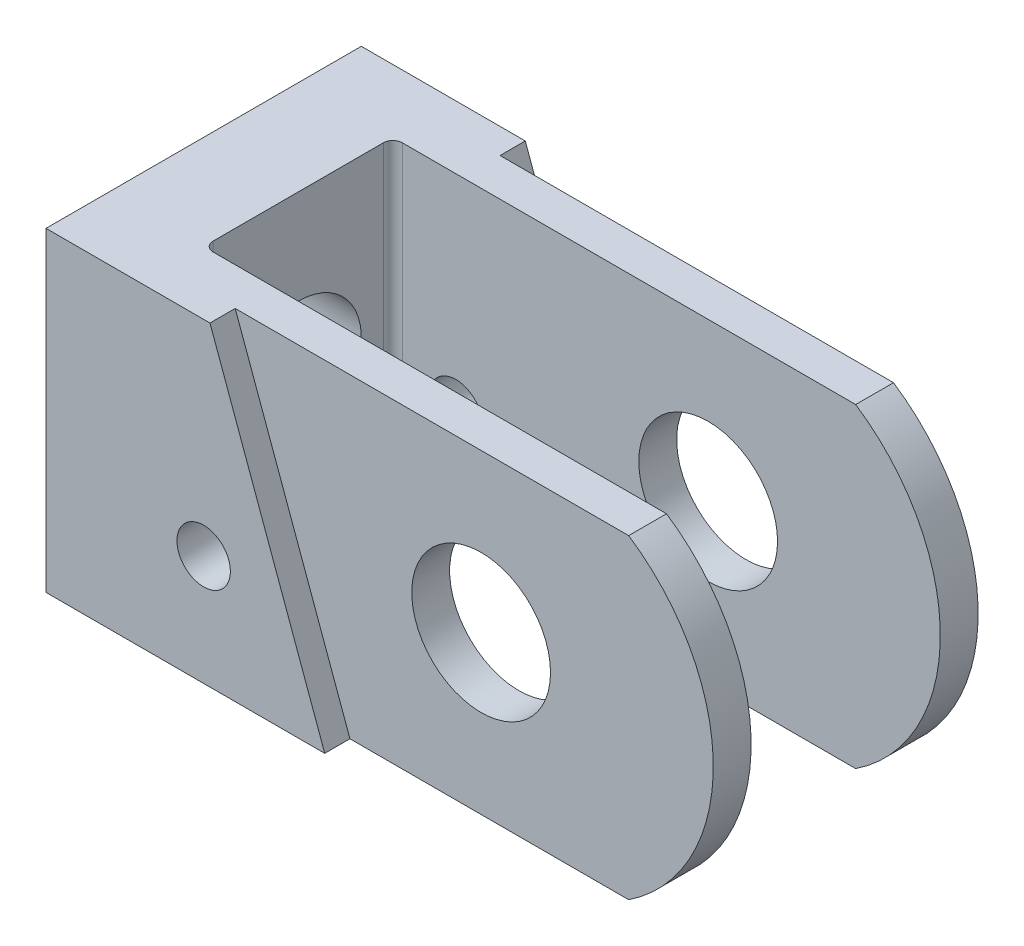
ISO-10303-21;
HEADER;
FILE_DESCRIPTION(('STEP AP214'),'2;1');
FILE_NAME('part.step','',(''),(''),'','','');
FILE_SCHEMA(('AUTOMOTIVE_DESIGN { 1 0 10303 214 1 1 1 1 }'));
ENDSEC;
DATA;
#1=APPLICATION_CONTEXT('core data for automotive mechanical design processes');
#2=APPLICATION_PROTOCOL_DEFINITION('international standard','automotive_design',2000,#1);
#3=PRODUCT_CONTEXT('',#1,'mechanical');
#4=PRODUCT('Part','Part','',(#3));
#5=PRODUCT_RELATED_PRODUCT_CATEGORY('part','',(#4));
#6=PRODUCT_DEFINITION_FORMATION('','',#4);
#7=PRODUCT_DEFINITION_CONTEXT('part definition',#1,'design');
#8=PRODUCT_DEFINITION('design','',#6,#7);
#9=PRODUCT_DEFINITION_SHAPE('','',#8);
#10=(LENGTH_UNIT() NAMED_UNIT(*) SI_UNIT(.MILLI.,.METRE.));
#11=(NAMED_UNIT(*) PLANE_ANGLE_UNIT() SI_UNIT($,.RADIAN.));
#12=(NAMED_UNIT(*) SI_UNIT($,.STERADIAN.) SOLID_ANGLE_UNIT());
#13=UNCERTAINTY_MEASURE_WITH_UNIT(LENGTH_MEASURE(1.E-05),#10,'distance_accuracy_value','');
#14=(GEOMETRIC_REPRESENTATION_CONTEXT(3) GLOBAL_UNCERTAINTY_ASSIGNED_CONTEXT((#13)) GLOBAL_UNIT_ASSIGNED_CONTEXT((#10,
#11,#12)) REPRESENTATION_CONTEXT('',''));
#15=CARTESIAN_POINT('',(0.,0.,0.));
#16=DIRECTION('',(0.,0.,1.));
#17=DIRECTION('',(1.,0.,0.));
#18=AXIS2_PLACEMENT_3D('',#15,#16,#17);
#19=CARTESIAN_POINT('',(0.,50.,26.3191489361702));
#20=DIRECTION('',(0.,0.,-1.));
#21=DIRECTION('',(-1.,0.,0.));
#22=AXIS2_PLACEMENT_3D('',#19,#20,#21);
#23=PLANE('',#22);
#24=CARTESIAN_POINT('',(30.8510638297872,25.,26.3191489361702));
#25=DIRECTION('',(0.,0.,1.));
#26=DIRECTION('',(1.,0.,0.));
#27=AXIS2_PLACEMENT_3D('',#24,#25,#26);
#28=CIRCLE('',#27,11.);
#29=CARTESIAN_POINT('',(41.8510638297872,25.,26.3191489361702));
#30=VERTEX_POINT('',#29);
#31=EDGE_CURVE('E231',#30,#30,#28,.T.);
#32=ORIENTED_EDGE('',*,*,#31,.F.);
#33=EDGE_LOOP('',(#32));
#34=FACE_BOUND('',#33,.T.);
#35=DIRECTION('',(1.,0.,0.));
#36=VECTOR('',#35,1.);
#37=CARTESIAN_POINT('',(0.,50.,26.3191489361702));
#38=LINE('',#37,#36);
#39=CARTESIAN_POINT('',(-8.14893617021278,50.,26.3191489361702));
#40=VERTEX_POINT('',#39);
#41=CARTESIAN_POINT('',(54.2426984198621,50.,26.3191489361702));
#42=VERTEX_POINT('',#41);
#43=EDGE_CURVE('E268',#40,#42,#38,.T.);
#44=ORIENTED_EDGE('',*,*,#43,.F.);
#45=DIRECTION('',(-0.342020143325673,0.939692620785907,0.));
#46=VECTOR('',#45,1.);
#47=CARTESIAN_POINT('',(-8.14893617021278,50.,26.3191489361702));
#48=LINE('',#47,#46);
#49=CARTESIAN_POINT('',(10.0495755430976,0.,26.3191489361702));
#50=VERTEX_POINT('',#49);
#51=EDGE_CURVE('E204',#50,#40,#48,.T.);
#52=ORIENTED_EDGE('',*,*,#51,.F.);
#53=DIRECTION('',(1.,0.,0.));
#54=VECTOR('',#53,1.);
#55=CARTESIAN_POINT('',(0.,0.,26.3191489361702));
#56=LINE('',#55,#54);
#57=CARTESIAN_POINT('',(54.2426984198621,0.,26.3191489361702));
#58=VERTEX_POINT('',#57);
#59=EDGE_CURVE('E76',#50,#58,#56,.T.);
#60=ORIENTED_EDGE('',*,*,#59,.T.);
#61=CARTESIAN_POINT('',(37.6595744680851,25.,26.3191489361702));
#62=DIRECTION('',(0.,0.,-1.));
#63=DIRECTION('',(1.,0.,0.));
#64=AXIS2_PLACEMENT_3D('',#61,#62,#63);
#65=CIRCLE('',#64,30.);
#66=EDGE_CURVE('E214',#42,#58,#65,.T.);
#67=ORIENTED_EDGE('',*,*,#66,.F.);
#68=EDGE_LOOP('',(#44,#52,#60,#67));
#69=FACE_BOUND('',#68,.T.);
#70=ADVANCED_FACE('F51',(#34,#69),#23,.F.);
#71=CARTESIAN_POINT('',(67.6595744680851,50.,20.3191489361702));
#72=DIRECTION('',(0.,0.,1.));
#73=DIRECTION('',(1.,0.,0.));
#74=AXIS2_PLACEMENT_3D('',#71,#72,#73);
#75=PLANE('',#74);
#76=CARTESIAN_POINT('',(-9.14893617021278,17.5,20.3191489361702));
#77=DIRECTION('',(0.,0.,1.));
#78=DIRECTION('',(1.,0.,0.));
#79=AXIS2_PLACEMENT_3D('',#76,#77,#78);
#80=CIRCLE('',#79,4.2371042598902);
#81=CARTESIAN_POINT('',(-4.91183191032258,17.5,20.3191489361702));
#82=VERTEX_POINT('',#81);
#83=EDGE_CURVE('E195',#82,#82,#80,.T.);
#84=ORIENTED_EDGE('',*,*,#83,.T.);
#85=EDGE_LOOP('',(#84));
#86=FACE_BOUND('',#85,.T.);
#87=CARTESIAN_POINT('',(30.8510638297872,25.,20.3191489361702));
#88=DIRECTION('',(0.,0.,1.));
#89=DIRECTION('',(1.,0.,0.));
#90=AXIS2_PLACEMENT_3D('',#87,#88,#89);
#91=CIRCLE('',#90,11.);
#92=CARTESIAN_POINT('',(41.8510638297872,25.,20.3191489361702));
#93=VERTEX_POINT('',#92);
#94=EDGE_CURVE('E240',#93,#93,#91,.T.);
#95=ORIENTED_EDGE('',*,*,#94,.T.);
#96=EDGE_LOOP('',(#95));
#97=FACE_BOUND('',#96,.T.);
#98=DIRECTION('',(-1.,0.,0.));
#99=VECTOR('',#98,1.);
#100=CARTESIAN_POINT('',(67.6595744680851,50.,20.3191489361702));
#101=LINE('',#100,#99);
#102=CARTESIAN_POINT('',(54.2426984198621,50.,20.3191489361702));
#103=VERTEX_POINT('',#102);
#104=CARTESIAN_POINT('',(-17.6489361702128,50.,20.3191489361702));
#105=VERTEX_POINT('',#104);
#106=EDGE_CURVE('E272',#103,#105,#101,.T.);
#107=ORIENTED_EDGE('',*,*,#106,.F.);
#108=CARTESIAN_POINT('',(37.6595744680851,25.,20.3191489361702));
#109=DIRECTION('',(0.,0.,1.));
#110=DIRECTION('',(1.,0.,0.));
#111=AXIS2_PLACEMENT_3D('',#108,#109,#110);
#112=CIRCLE('',#111,30.);
#113=CARTESIAN_POINT('',(54.2426984198621,0.,20.3191489361702));
#114=VERTEX_POINT('',#113);
#115=EDGE_CURVE('E227',#103,#114,#112,.F.);
#116=ORIENTED_EDGE('',*,*,#115,.T.);
#117=DIRECTION('',(-1.,0.,0.));
#118=VECTOR('',#117,1.);
#119=CARTESIAN_POINT('',(67.6595744680851,0.,20.3191489361702));
#120=LINE('',#119,#118);
#121=CARTESIAN_POINT('',(-17.6489361702128,0.,20.3191489361702));
#122=VERTEX_POINT('',#121);
#123=EDGE_CURVE('E296',#114,#122,#120,.T.);
#124=ORIENTED_EDGE('',*,*,#123,.T.);
#125=DIRECTION('',(0.,-1.,0.));
#126=VECTOR('',#125,1.);
#127=CARTESIAN_POINT('',(-17.6489361702128,50.,20.3191489361702));
#128=LINE('',#127,#126);
#129=EDGE_CURVE('E325',#105,#122,#128,.T.);
#130=ORIENTED_EDGE('',*,*,#129,.F.);
#131=EDGE_LOOP('',(#107,#116,#124,#130));
#132=FACE_BOUND('',#131,.T.);
#133=ADVANCED_FACE('F353',(#86,#97,#132),#75,.F.);
#134=CARTESIAN_POINT('',(67.6595744680851,50.,-9.68085106382979));
#135=DIRECTION('',(0.,0.,-1.));
#136=DIRECTION('',(-1.,0.,0.));
#137=AXIS2_PLACEMENT_3D('',#134,#135,#136);
#138=PLANE('',#137);
#139=CARTESIAN_POINT('',(-9.14893617021278,17.5,-9.68085106382979));
#140=DIRECTION('',(0.,0.,-1.));
#141=DIRECTION('',(-1.,0.,0.));
#142=AXIS2_PLACEMENT_3D('',#139,#140,#141);
#143=CIRCLE('',#142,4.2371042598902);
#144=CARTESIAN_POINT('',(-13.386040430103,17.5,-9.68085106382979));
#145=VERTEX_POINT('',#144);
#146=EDGE_CURVE('E191',#145,#145,#143,.T.);
#147=ORIENTED_EDGE('',*,*,#146,.T.);
#148=EDGE_LOOP('',(#147));
#149=FACE_BOUND('',#148,.T.);
#150=CARTESIAN_POINT('',(30.8510638297872,25.,-9.68085106382979));
#151=DIRECTION('',(0.,0.,-1.));
#152=DIRECTION('',(-1.,0.,0.));
#153=AXIS2_PLACEMENT_3D('',#150,#151,#152);
#154=CIRCLE('',#153,11.);
#155=CARTESIAN_POINT('',(19.8510638297872,25.,-9.68085106382979));
#156=VERTEX_POINT('',#155);
#157=EDGE_CURVE('E236',#156,#156,#154,.T.);
#158=ORIENTED_EDGE('',*,*,#157,.T.);
#159=EDGE_LOOP('',(#158));
#160=FACE_BOUND('',#159,.T.);
#161=DIRECTION('',(1.,0.,0.));
#162=VECTOR('',#161,1.);
#163=CARTESIAN_POINT('',(67.6595744680851,0.,-9.68085106382979));
#164=LINE('',#163,#162);
#165=CARTESIAN_POINT('',(-17.6489361702128,0.,-9.68085106382979));
#166=VERTEX_POINT('',#165);
#167=CARTESIAN_POINT('',(54.2426984198621,0.,-9.68085106382979));
#168=VERTEX_POINT('',#167);
#169=EDGE_CURVE('E308',#166,#168,#164,.T.);
#170=ORIENTED_EDGE('',*,*,#169,.T.);
#171=CARTESIAN_POINT('',(37.6595744680851,25.,-9.68085106382979));
#172=DIRECTION('',(0.,0.,-1.));
#173=DIRECTION('',(-1.,0.,0.));
#174=AXIS2_PLACEMENT_3D('',#171,#172,#173);
#175=CIRCLE('',#174,30.);
#176=CARTESIAN_POINT('',(54.2426984198621,50.,-9.68085106382979));
#177=VERTEX_POINT('',#176);
#178=EDGE_CURVE('E224',#168,#177,#175,.F.);
#179=ORIENTED_EDGE('',*,*,#178,.T.);
#180=DIRECTION('',(1.,0.,0.));
#181=VECTOR('',#180,1.);
#182=CARTESIAN_POINT('',(67.6595744680851,50.,-9.68085106382979));
#183=LINE('',#182,#181);
#184=CARTESIAN_POINT('',(-17.6489361702128,50.,-9.68085106382979));
#185=VERTEX_POINT('',#184);
#186=EDGE_CURVE('E167',#185,#177,#183,.T.);
#187=ORIENTED_EDGE('',*,*,#186,.F.);
#188=DIRECTION('',(0.,-1.,0.));
#189=VECTOR('',#188,1.);
#190=CARTESIAN_POINT('',(-17.6489361702128,50.,-9.68085106382979));
#191=LINE('',#190,#189);
#192=EDGE_CURVE('E166',#185,#166,#191,.T.);
#193=ORIENTED_EDGE('',*,*,#192,.T.);
#194=EDGE_LOOP('',(#170,#179,#187,#193));
#195=FACE_BOUND('',#194,.T.);
#196=ADVANCED_FACE('F377',(#149,#160,#195),#138,.F.);
#197=CARTESIAN_POINT('',(0.,50.,-15.6808510638298));
#198=DIRECTION('',(0.,0.,1.));
#199=DIRECTION('',(1.,0.,0.));
#200=AXIS2_PLACEMENT_3D('',#197,#198,#199);
#201=PLANE('',#200);
#202=CARTESIAN_POINT('',(30.8510638297872,25.,-15.6808510638298));
#203=DIRECTION('',(0.,0.,1.));
#204=DIRECTION('',(1.,0.,0.));
#205=AXIS2_PLACEMENT_3D('',#202,#203,#204);
#206=CIRCLE('',#205,11.);
#207=CARTESIAN_POINT('',(41.8510638297872,25.,-15.6808510638298));
#208=VERTEX_POINT('',#207);
#209=EDGE_CURVE('E235',#208,#208,#206,.T.);
#210=ORIENTED_EDGE('',*,*,#209,.T.);
#211=EDGE_LOOP('',(#210));
#212=FACE_BOUND('',#211,.T.);
#213=DIRECTION('',(-1.,0.,0.));
#214=VECTOR('',#213,1.);
#215=CARTESIAN_POINT('',(0.,0.,-15.6808510638298));
#216=LINE('',#215,#214);
#217=CARTESIAN_POINT('',(54.2426984198621,0.,-15.6808510638298));
#218=VERTEX_POINT('',#217);
#219=CARTESIAN_POINT('',(10.0495755430976,0.,-15.6808510638298));
#220=VERTEX_POINT('',#219);
#221=EDGE_CURVE('E68',#218,#220,#216,.T.);
#222=ORIENTED_EDGE('',*,*,#221,.T.);
#223=DIRECTION('',(0.342020143325673,-0.939692620785907,0.));
#224=VECTOR('',#223,1.);
#225=CARTESIAN_POINT('',(-8.14893617021279,50.,-15.6808510638298));
#226=LINE('',#225,#224);
#227=CARTESIAN_POINT('',(-8.14893617021279,50.,-15.6808510638298));
#228=VERTEX_POINT('',#227);
#229=EDGE_CURVE('E169',#228,#220,#226,.T.);
#230=ORIENTED_EDGE('',*,*,#229,.F.);
#231=DIRECTION('',(-1.,0.,0.));
#232=VECTOR('',#231,1.);
#233=CARTESIAN_POINT('',(0.,50.,-15.6808510638298));
#234=LINE('',#233,#232);
#235=CARTESIAN_POINT('',(54.2426984198621,50.,-15.6808510638298));
#236=VERTEX_POINT('',#235);
#237=EDGE_CURVE('E157',#236,#228,#234,.T.);
#238=ORIENTED_EDGE('',*,*,#237,.F.);
#239=CARTESIAN_POINT('',(37.6595744680851,25.,-15.6808510638298));
#240=DIRECTION('',(0.,0.,1.));
#241=DIRECTION('',(1.,0.,0.));
#242=AXIS2_PLACEMENT_3D('',#239,#240,#241);
#243=CIRCLE('',#242,30.);
#244=EDGE_CURVE('E221',#236,#218,#243,.F.);
#245=ORIENTED_EDGE('',*,*,#244,.T.);
#246=EDGE_LOOP('',(#222,#230,#238,#245));
#247=FACE_BOUND('',#246,.T.);
#248=ADVANCED_FACE('F170',(#212,#247),#201,.F.);
#249=CARTESIAN_POINT('',(-34.1489361702128,50.,-19.6808510638298));
#250=DIRECTION('',(0.,0.,1.));
#251=DIRECTION('',(1.,0.,0.));
#252=AXIS2_PLACEMENT_3D('',#249,#250,#251);
#253=PLANE('',#252);
#254=DIRECTION('',(-1.,0.,0.));
#255=VECTOR('',#254,1.);
#256=CARTESIAN_POINT('',(-34.1489361702128,50.,-19.6808510638298));
#257=LINE('',#256,#255);
#258=CARTESIAN_POINT('',(-8.14893617021279,50.,-19.6808510638298));
#259=VERTEX_POINT('',#258);
#260=CARTESIAN_POINT('',(-34.1489361702128,50.,-19.6808510638298));
#261=VERTEX_POINT('',#260);
#262=EDGE_CURVE('E258',#259,#261,#257,.T.);
#263=ORIENTED_EDGE('',*,*,#262,.F.);
#264=DIRECTION('',(0.342020143325673,-0.939692620785907,0.));
#265=VECTOR('',#264,1.);
#266=CARTESIAN_POINT('',(-8.14893617021279,50.,-19.6808510638298));
#267=LINE('',#266,#265);
#268=CARTESIAN_POINT('',(10.0495755430976,0.,-19.6808510638298));
#269=VERTEX_POINT('',#268);
#270=EDGE_CURVE('E176',#259,#269,#267,.T.);
#271=ORIENTED_EDGE('',*,*,#270,.T.);
#272=DIRECTION('',(-1.,0.,0.));
#273=VECTOR('',#272,1.);
#274=CARTESIAN_POINT('',(-34.1489361702128,0.,-19.6808510638298));
#275=LINE('',#274,#273);
#276=CARTESIAN_POINT('',(-34.1489361702128,0.,-19.6808510638298));
#277=VERTEX_POINT('',#276);
#278=EDGE_CURVE('E253',#269,#277,#275,.T.);
#279=ORIENTED_EDGE('',*,*,#278,.T.);
#280=DIRECTION('',(0.,-1.,0.));
#281=VECTOR('',#280,1.);
#282=CARTESIAN_POINT('',(-34.1489361702128,50.,-19.6808510638298));
#283=LINE('',#282,#281);
#284=EDGE_CURVE('E333',#261,#277,#283,.T.);
#285=ORIENTED_EDGE('',*,*,#284,.F.);
#286=EDGE_LOOP('',(#263,#271,#279,#285));
#287=FACE_BOUND('',#286,.T.);
#288=ADVANCED_FACE('F53',(#287),#253,.F.);
#289=CARTESIAN_POINT('',(-34.1489361702128,50.,-19.6808510638298));
#290=DIRECTION('',(1.,0.,0.));
#291=DIRECTION('',(0.,0.,-1.));
#292=AXIS2_PLACEMENT_3D('',#289,#290,#291);
#293=PLANE('',#292);
#294=CARTESIAN_POINT('',(-34.1489361702128,25.,5.31914893617021));
#295=DIRECTION('',(-1.,0.,0.));
#296=DIRECTION('',(0.,0.,1.));
#297=AXIS2_PLACEMENT_3D('',#294,#295,#296);
#298=CIRCLE('',#297,17.5);
#299=CARTESIAN_POINT('',(-34.1489361702128,25.,22.8191489361702));
#300=VERTEX_POINT('',#299);
#301=EDGE_CURVE('E254',#300,#300,#298,.T.);
#302=ORIENTED_EDGE('',*,*,#301,.F.);
#303=EDGE_LOOP('',(#302));
#304=FACE_BOUND('',#303,.T.);
#305=DIRECTION('',(0.,0.,1.));
#306=VECTOR('',#305,1.);
#307=CARTESIAN_POINT('',(-34.1489361702128,0.,-19.6808510638298));
#308=LINE('',#307,#306);
#309=CARTESIAN_POINT('',(-34.1489361702128,0.,30.3191489361702));
#310=VERTEX_POINT('',#309);
#311=EDGE_CURVE('E288',#277,#310,#308,.T.);
#312=ORIENTED_EDGE('',*,*,#311,.T.);
#313=DIRECTION('',(0.,-1.,0.));
#314=VECTOR('',#313,1.);
#315=CARTESIAN_POINT('',(-34.1489361702128,50.,30.3191489361702));
#316=LINE('',#315,#314);
#317=CARTESIAN_POINT('',(-34.1489361702128,50.,30.3191489361702));
#318=VERTEX_POINT('',#317);
#319=EDGE_CURVE('E329',#318,#310,#316,.T.);
#320=ORIENTED_EDGE('',*,*,#319,.F.);
#321=DIRECTION('',(0.,0.,1.));
#322=VECTOR('',#321,1.);
#323=CARTESIAN_POINT('',(-34.1489361702128,50.,-19.6808510638298));
#324=LINE('',#323,#322);
#325=EDGE_CURVE('E261',#261,#318,#324,.T.);
#326=ORIENTED_EDGE('',*,*,#325,.F.);
#327=ORIENTED_EDGE('',*,*,#284,.T.);
#328=EDGE_LOOP('',(#312,#320,#326,#327));
#329=FACE_BOUND('',#328,.T.);
#330=ADVANCED_FACE('F370',(#304,#329),#293,.F.);
#331=CARTESIAN_POINT('',(-34.1489361702128,50.,30.3191489361702));
#332=DIRECTION('',(0.,0.,-1.));
#333=DIRECTION('',(-1.,0.,0.));
#334=AXIS2_PLACEMENT_3D('',#331,#332,#333);
#335=PLANE('',#334);
#336=CARTESIAN_POINT('',(-9.14893617021278,17.5,30.3191489361702));
#337=DIRECTION('',(0.,0.,1.));
#338=DIRECTION('',(1.,0.,0.));
#339=AXIS2_PLACEMENT_3D('',#336,#337,#338);
#340=CIRCLE('',#339,4.2371042598902);
#341=CARTESIAN_POINT('',(-4.91183191032258,17.5,30.3191489361702));
#342=VERTEX_POINT('',#341);
#343=EDGE_CURVE('E187',#342,#342,#340,.T.);
#344=ORIENTED_EDGE('',*,*,#343,.F.);
#345=EDGE_LOOP('',(#344));
#346=FACE_BOUND('',#345,.T.);
#347=DIRECTION('',(-0.342020143325673,0.939692620785907,0.));
#348=VECTOR('',#347,1.);
#349=CARTESIAN_POINT('',(-8.14893617021278,50.,30.3191489361702));
#350=LINE('',#349,#348);
#351=CARTESIAN_POINT('',(10.0495755430976,0.,30.3191489361702));
#352=VERTEX_POINT('',#351);
#353=CARTESIAN_POINT('',(-8.14893617021278,50.,30.3191489361702));
#354=VERTEX_POINT('',#353);
#355=EDGE_CURVE('E203',#352,#354,#350,.T.);
#356=ORIENTED_EDGE('',*,*,#355,.T.);
#357=DIRECTION('',(1.,0.,0.));
#358=VECTOR('',#357,1.);
#359=CARTESIAN_POINT('',(-34.1489361702128,50.,30.3191489361702));
#360=LINE('',#359,#358);
#361=EDGE_CURVE('E264',#318,#354,#360,.T.);
#362=ORIENTED_EDGE('',*,*,#361,.F.);
#363=ORIENTED_EDGE('',*,*,#319,.T.);
#364=DIRECTION('',(1.,0.,0.));
#365=VECTOR('',#364,1.);
#366=CARTESIAN_POINT('',(-34.1489361702128,0.,30.3191489361702));
#367=LINE('',#366,#365);
#368=EDGE_CURVE('E291',#310,#352,#367,.T.);
#369=ORIENTED_EDGE('',*,*,#368,.T.);
#370=EDGE_LOOP('',(#356,#362,#363,#369));
#371=FACE_BOUND('',#370,.T.);
#372=ADVANCED_FACE('F365',(#346,#371),#335,.F.);
#373=CARTESIAN_POINT('',(-17.6489361702128,50.,18.8191489361702));
#374=DIRECTION('',(0.,-1.,0.));
#375=DIRECTION('',(0.,0.,-1.));
#376=AXIS2_PLACEMENT_3D('',#373,#374,#375);
#377=CYLINDRICAL_SURFACE('',#376,1.5);
#378=CARTESIAN_POINT('',(-17.6489361702128,0.,18.8191489361702));
#379=DIRECTION('',(0.,-1.,0.));
#380=DIRECTION('',(0.,0.,-1.));
#381=AXIS2_PLACEMENT_3D('',#378,#379,#380);
#382=CIRCLE('',#381,1.5);
#383=CARTESIAN_POINT('',(-19.1489361702128,0.,18.8191489361702));
#384=VERTEX_POINT('',#383);
#385=EDGE_CURVE('E299',#122,#384,#382,.T.);
#386=ORIENTED_EDGE('',*,*,#385,.T.);
#387=DIRECTION('',(0.,-1.,0.));
#388=VECTOR('',#387,1.);
#389=CARTESIAN_POINT('',(-19.1489361702128,50.,18.8191489361702));
#390=LINE('',#389,#388);
#391=CARTESIAN_POINT('',(-19.1489361702128,50.,18.8191489361702));
#392=VERTEX_POINT('',#391);
#393=EDGE_CURVE('E321',#392,#384,#390,.T.);
#394=ORIENTED_EDGE('',*,*,#393,.F.);
#395=CARTESIAN_POINT('',(-17.6489361702128,50.,18.8191489361702));
#396=DIRECTION('',(0.,-1.,0.));
#397=DIRECTION('',(0.,0.,-1.));
#398=AXIS2_PLACEMENT_3D('',#395,#396,#397);
#399=CIRCLE('',#398,1.5);
#400=EDGE_CURVE('E275',#105,#392,#399,.T.);
#401=ORIENTED_EDGE('',*,*,#400,.F.);
#402=ORIENTED_EDGE('',*,*,#129,.T.);
#403=EDGE_LOOP('',(#386,#394,#401,#402));
#404=FACE_BOUND('',#403,.T.);
#405=ADVANCED_FACE('F389',(#404),#377,.F.);
#406=CARTESIAN_POINT('',(-19.1489361702128,50.,-8.18085106382978));
#407=DIRECTION('',(-1.,0.,0.));
#408=DIRECTION('',(0.,0.,1.));
#409=AXIS2_PLACEMENT_3D('',#406,#407,#408);
#410=PLANE('',#409);
#411=CARTESIAN_POINT('',(-19.1489361702128,25.,5.31914893617021));
#412=DIRECTION('',(-1.,0.,0.));
#413=DIRECTION('',(0.,0.,1.));
#414=AXIS2_PLACEMENT_3D('',#411,#412,#413);
#415=CIRCLE('',#414,10.);
#416=CARTESIAN_POINT('',(-19.1489361702128,25.,15.3191489361702));
#417=VERTEX_POINT('',#416);
#418=EDGE_CURVE('E248',#417,#417,#415,.T.);
#419=ORIENTED_EDGE('',*,*,#418,.T.);
#420=EDGE_LOOP('',(#419));
#421=FACE_BOUND('',#420,.T.);
#422=DIRECTION('',(0.,0.,-1.));
#423=VECTOR('',#422,1.);
#424=CARTESIAN_POINT('',(-19.1489361702128,0.,-8.18085106382978));
#425=LINE('',#424,#423);
#426=CARTESIAN_POINT('',(-19.1489361702128,0.,-8.18085106382978));
#427=VERTEX_POINT('',#426);
#428=EDGE_CURVE('E302',#384,#427,#425,.T.);
#429=ORIENTED_EDGE('',*,*,#428,.T.);
#430=DIRECTION('',(0.,-1.,0.));
#431=VECTOR('',#430,1.);
#432=CARTESIAN_POINT('',(-19.1489361702128,50.,-8.18085106382978));
#433=LINE('',#432,#431);
#434=CARTESIAN_POINT('',(-19.1489361702128,50.,-8.18085106382978));
#435=VERTEX_POINT('',#434);
#436=EDGE_CURVE('E317',#435,#427,#433,.T.);
#437=ORIENTED_EDGE('',*,*,#436,.F.);
#438=DIRECTION('',(0.,0.,-1.));
#439=VECTOR('',#438,1.);
#440=CARTESIAN_POINT('',(-19.1489361702128,50.,-8.18085106382978));
#441=LINE('',#440,#439);
#442=EDGE_CURVE('E278',#392,#435,#441,.T.);
#443=ORIENTED_EDGE('',*,*,#442,.F.);
#444=ORIENTED_EDGE('',*,*,#393,.T.);
#445=EDGE_LOOP('',(#429,#437,#443,#444));
#446=FACE_BOUND('',#445,.T.);
#447=ADVANCED_FACE('F386',(#421,#446),#410,.F.);
#448=CARTESIAN_POINT('',(-17.6489361702128,50.,-8.18085106382979));
#449=DIRECTION('',(0.,-1.,0.));
#450=DIRECTION('',(0.,0.,-1.));
#451=AXIS2_PLACEMENT_3D('',#448,#449,#450);
#452=CYLINDRICAL_SURFACE('',#451,1.5);
#453=CARTESIAN_POINT('',(-17.6489361702128,0.,-8.18085106382979));
#454=DIRECTION('',(0.,-1.,0.));
#455=DIRECTION('',(0.,0.,1.));
#456=AXIS2_PLACEMENT_3D('',#453,#454,#455);
#457=CIRCLE('',#456,1.5);
#458=EDGE_CURVE('E305',#427,#166,#457,.T.);
#459=ORIENTED_EDGE('',*,*,#458,.T.);
#460=ORIENTED_EDGE('',*,*,#192,.F.);
#461=CARTESIAN_POINT('',(-17.6489361702128,50.,-8.18085106382979));
#462=DIRECTION('',(0.,-1.,0.));
#463=DIRECTION('',(0.,0.,1.));
#464=AXIS2_PLACEMENT_3D('',#461,#462,#463);
#465=CIRCLE('',#464,1.5);
#466=EDGE_CURVE('E281',#435,#185,#465,.T.);
#467=ORIENTED_EDGE('',*,*,#466,.F.);
#468=ORIENTED_EDGE('',*,*,#436,.T.);
#469=EDGE_LOOP('',(#459,#460,#467,#468));
#470=FACE_BOUND('',#469,.T.);
#471=ADVANCED_FACE('F382',(#470),#452,.F.);
#472=CARTESIAN_POINT('',(-17.6489361702128,50.,-8.18085106382979));
#473=DIRECTION('',(0.,1.,0.));
#474=DIRECTION('',(0.,0.,1.));
#475=AXIS2_PLACEMENT_3D('',#472,#473,#474);
#476=PLANE('',#475);
#477=DIRECTION('',(0.,0.,-1.));
#478=VECTOR('',#477,1.);
#479=CARTESIAN_POINT('',(-8.14893617021279,50.,-15.6808510638298));
#480=LINE('',#479,#478);
#481=EDGE_CURVE('E160',#228,#259,#480,.T.);
#482=ORIENTED_EDGE('',*,*,#481,.T.);
#483=ORIENTED_EDGE('',*,*,#262,.T.);
#484=ORIENTED_EDGE('',*,*,#325,.T.);
#485=ORIENTED_EDGE('',*,*,#361,.T.);
#486=DIRECTION('',(0.,0.,1.));
#487=VECTOR('',#486,1.);
#488=CARTESIAN_POINT('',(-8.14893617021278,50.,26.3191489361702));
#489=LINE('',#488,#487);
#490=EDGE_CURVE('E199',#40,#354,#489,.T.);
#491=ORIENTED_EDGE('',*,*,#490,.F.);
#492=ORIENTED_EDGE('',*,*,#43,.T.);
#493=DIRECTION('',(0.,0.,1.));
#494=VECTOR('',#493,1.);
#495=CARTESIAN_POINT('',(54.2426984198621,50.,-19.6808510638298));
#496=LINE('',#495,#494);
#497=EDGE_CURVE('E217',#103,#42,#496,.T.);
#498=ORIENTED_EDGE('',*,*,#497,.F.);
#499=ORIENTED_EDGE('',*,*,#106,.T.);
#500=ORIENTED_EDGE('',*,*,#400,.T.);
#501=ORIENTED_EDGE('',*,*,#442,.T.);
#502=ORIENTED_EDGE('',*,*,#466,.T.);
#503=ORIENTED_EDGE('',*,*,#186,.T.);
#504=EDGE_CURVE('E164',#236,#177,#496,.T.);
#505=ORIENTED_EDGE('',*,*,#504,.F.);
#506=ORIENTED_EDGE('',*,*,#237,.T.);
#507=EDGE_LOOP('',(#482,#483,#484,#485,#491,#492,#498,#499,#500,#501,#502,#503,#505,#506));
#508=FACE_BOUND('',#507,.T.);
#509=ADVANCED_FACE('F158',(#508),#476,.T.);
#510=CARTESIAN_POINT('',(-17.6489361702128,0.,-8.18085106382979));
#511=DIRECTION('',(0.,1.,0.));
#512=DIRECTION('',(0.,0.,1.));
#513=AXIS2_PLACEMENT_3D('',#510,#511,#512);
#514=PLANE('',#513);
#515=ORIENTED_EDGE('',*,*,#278,.F.);
#516=DIRECTION('',(0.,0.,-1.));
#517=VECTOR('',#516,1.);
#518=CARTESIAN_POINT('',(10.0495755430976,0.,-15.6808510638298));
#519=LINE('',#518,#517);
#520=EDGE_CURVE('E175',#220,#269,#519,.T.);
#521=ORIENTED_EDGE('',*,*,#520,.F.);
#522=ORIENTED_EDGE('',*,*,#221,.F.);
#523=DIRECTION('',(0.,0.,1.));
#524=VECTOR('',#523,1.);
#525=CARTESIAN_POINT('',(54.2426984198621,0.,-19.6808510638298));
#526=LINE('',#525,#524);
#527=EDGE_CURVE('E13',#218,#168,#526,.T.);
#528=ORIENTED_EDGE('',*,*,#527,.T.);
#529=ORIENTED_EDGE('',*,*,#169,.F.);
#530=ORIENTED_EDGE('',*,*,#458,.F.);
#531=ORIENTED_EDGE('',*,*,#428,.F.);
#532=ORIENTED_EDGE('',*,*,#385,.F.);
#533=ORIENTED_EDGE('',*,*,#123,.F.);
#534=EDGE_CURVE('E61',#114,#58,#526,.T.);
#535=ORIENTED_EDGE('',*,*,#534,.T.);
#536=ORIENTED_EDGE('',*,*,#59,.F.);
#537=DIRECTION('',(0.,0.,1.));
#538=VECTOR('',#537,1.);
#539=CARTESIAN_POINT('',(10.0495755430976,0.,26.3191489361702));
#540=LINE('',#539,#538);
#541=EDGE_CURVE('E208',#50,#352,#540,.T.);
#542=ORIENTED_EDGE('',*,*,#541,.T.);
#543=ORIENTED_EDGE('',*,*,#368,.F.);
#544=ORIENTED_EDGE('',*,*,#311,.F.);
#545=EDGE_LOOP('',(#515,#521,#522,#528,#529,#530,#531,#532,#533,#535,#536,#542,#543,#544));
#546=FACE_BOUND('',#545,.T.);
#547=ADVANCED_FACE('F346',(#546),#514,.F.);
#548=CARTESIAN_POINT('',(-32.1489361702128,25.,5.31914893617021));
#549=DIRECTION('',(-1.,0.,0.));
#550=DIRECTION('',(0.,0.,1.));
#551=AXIS2_PLACEMENT_3D('',#548,#549,#550);
#552=CYLINDRICAL_SURFACE('',#551,17.5);
#553=CARTESIAN_POINT('',(-32.1489361702128,25.,5.31914893617021));
#554=DIRECTION('',(-1.,0.,0.));
#555=DIRECTION('',(0.,0.,1.));
#556=AXIS2_PLACEMENT_3D('',#553,#554,#555);
#557=CIRCLE('',#556,17.5);
#558=CARTESIAN_POINT('',(-32.1489361702128,25.,22.8191489361702));
#559=VERTEX_POINT('',#558);
#560=EDGE_CURVE('E249',#559,#559,#557,.T.);
#561=ORIENTED_EDGE('',*,*,#560,.F.);
#562=EDGE_LOOP('',(#561));
#563=FACE_BOUND('',#562,.T.);
#564=ORIENTED_EDGE('',*,*,#301,.T.);
#565=EDGE_LOOP('',(#564));
#566=FACE_BOUND('',#565,.T.);
#567=ADVANCED_FACE('F416',(#563,#566),#552,.F.);
#568=CARTESIAN_POINT('',(-32.1489361702128,25.,5.31914893617021));
#569=DIRECTION('',(-1.,0.,0.));
#570=DIRECTION('',(0.,0.,1.));
#571=AXIS2_PLACEMENT_3D('',#568,#569,#570);
#572=PLANE('',#571);
#573=CARTESIAN_POINT('',(-32.1489361702128,25.,5.31914893617021));
#574=DIRECTION('',(-1.,0.,0.));
#575=DIRECTION('',(0.,0.,1.));
#576=AXIS2_PLACEMENT_3D('',#573,#574,#575);
#577=CIRCLE('',#576,10.);
#578=CARTESIAN_POINT('',(-32.1489361702128,25.,15.3191489361702));
#579=VERTEX_POINT('',#578);
#580=EDGE_CURVE('E244',#579,#579,#577,.T.);
#581=ORIENTED_EDGE('',*,*,#580,.F.);
#582=EDGE_LOOP('',(#581));
#583=FACE_BOUND('',#582,.T.);
#584=ORIENTED_EDGE('',*,*,#560,.T.);
#585=EDGE_LOOP('',(#584));
#586=FACE_BOUND('',#585,.T.);
#587=ADVANCED_FACE('F418',(#583,#586),#572,.T.);
#588=CARTESIAN_POINT('',(-7.14893617021278,25.,5.31914893617021));
#589=DIRECTION('',(-1.,0.,0.));
#590=DIRECTION('',(0.,0.,1.));
#591=AXIS2_PLACEMENT_3D('',#588,#589,#590);
#592=CYLINDRICAL_SURFACE('',#591,10.);
#593=ORIENTED_EDGE('',*,*,#580,.T.);
#594=EDGE_LOOP('',(#593));
#595=FACE_BOUND('',#594,.T.);
#596=ORIENTED_EDGE('',*,*,#418,.F.);
#597=EDGE_LOOP('',(#596));
#598=FACE_BOUND('',#597,.T.);
#599=ADVANCED_FACE('F425',(#595,#598),#592,.F.);
#600=CARTESIAN_POINT('',(30.8510638297872,25.,-19.6808510638298));
#601=DIRECTION('',(0.,0.,1.));
#602=DIRECTION('',(1.,0.,0.));
#603=AXIS2_PLACEMENT_3D('',#600,#601,#602);
#604=CYLINDRICAL_SURFACE('',#603,11.);
#605=ORIENTED_EDGE('',*,*,#209,.F.);
#606=EDGE_LOOP('',(#605));
#607=FACE_BOUND('',#606,.T.);
#608=ORIENTED_EDGE('',*,*,#157,.F.);
#609=EDGE_LOOP('',(#608));
#610=FACE_BOUND('',#609,.T.);
#611=ADVANCED_FACE('F549',(#607,#610),#604,.F.);
#612=ORIENTED_EDGE('',*,*,#31,.T.);
#613=EDGE_LOOP('',(#612));
#614=FACE_BOUND('',#613,.T.);
#615=ORIENTED_EDGE('',*,*,#94,.F.);
#616=EDGE_LOOP('',(#615));
#617=FACE_BOUND('',#616,.T.);
#618=ADVANCED_FACE('F557',(#614,#617),#604,.F.);
#619=CARTESIAN_POINT('',(37.6595744680851,25.,-19.6808510638298));
#620=DIRECTION('',(0.,0.,1.));
#621=DIRECTION('',(1.,0.,0.));
#622=AXIS2_PLACEMENT_3D('',#619,#620,#621);
#623=CYLINDRICAL_SURFACE('',#622,30.);
#624=ORIENTED_EDGE('',*,*,#66,.T.);
#625=ORIENTED_EDGE('',*,*,#534,.F.);
#626=ORIENTED_EDGE('',*,*,#115,.F.);
#627=ORIENTED_EDGE('',*,*,#497,.T.);
#628=EDGE_LOOP('',(#624,#625,#626,#627));
#629=FACE_BOUND('',#628,.T.);
#630=ADVANCED_FACE('F349',(#629),#623,.T.);
#631=ORIENTED_EDGE('',*,*,#527,.F.);
#632=ORIENTED_EDGE('',*,*,#244,.F.);
#633=ORIENTED_EDGE('',*,*,#504,.T.);
#634=ORIENTED_EDGE('',*,*,#178,.F.);
#635=EDGE_LOOP('',(#631,#632,#633,#634));
#636=FACE_BOUND('',#635,.T.);
#637=ADVANCED_FACE('F592',(#636),#623,.T.);
#638=CARTESIAN_POINT('',(-8.14893617021278,50.,26.3191489361702));
#639=DIRECTION('',(0.939692620785907,0.342020143325673,0.));
#640=DIRECTION('',(-0.342020143325673,0.939692620785907,0.));
#641=AXIS2_PLACEMENT_3D('',#638,#639,#640);
#642=PLANE('',#641);
#643=ORIENTED_EDGE('',*,*,#51,.T.);
#644=ORIENTED_EDGE('',*,*,#490,.T.);
#645=ORIENTED_EDGE('',*,*,#355,.F.);
#646=ORIENTED_EDGE('',*,*,#541,.F.);
#647=EDGE_LOOP('',(#643,#644,#645,#646));
#648=FACE_BOUND('',#647,.T.);
#649=ADVANCED_FACE('F360',(#648),#642,.T.);
#650=CARTESIAN_POINT('',(-9.14893617021278,17.5,-19.6808510638298));
#651=DIRECTION('',(0.,0.,1.));
#652=DIRECTION('',(1.,0.,0.));
#653=AXIS2_PLACEMENT_3D('',#650,#651,#652);
#654=CYLINDRICAL_SURFACE('',#653,4.2371042598902);
#655=ORIENTED_EDGE('',*,*,#343,.T.);
#656=EDGE_LOOP('',(#655));
#657=FACE_BOUND('',#656,.T.);
#658=ORIENTED_EDGE('',*,*,#83,.F.);
#659=EDGE_LOOP('',(#658));
#660=FACE_BOUND('',#659,.T.);
#661=ADVANCED_FACE('F464',(#657,#660),#654,.F.);
#662=CARTESIAN_POINT('',(-9.14893617021278,17.5,-15.6808510638298));
#663=DIRECTION('',(0.,0.,1.));
#664=DIRECTION('',(1.,0.,0.));
#665=AXIS2_PLACEMENT_3D('',#662,#663,#664);
#666=CIRCLE('',#665,4.2371042598902);
#667=CARTESIAN_POINT('',(-4.91183191032258,17.5,-15.6808510638298));
#668=VERTEX_POINT('',#667);
#669=EDGE_CURVE('E55',#668,#668,#666,.F.);
#670=ORIENTED_EDGE('',*,*,#669,.T.);
#671=EDGE_LOOP('',(#670));
#672=FACE_BOUND('',#671,.T.);
#673=ORIENTED_EDGE('',*,*,#146,.F.);
#674=EDGE_LOOP('',(#673));
#675=FACE_BOUND('',#674,.T.);
#676=ADVANCED_FACE('F469',(#672,#675),#654,.F.);
#677=CARTESIAN_POINT('',(0.,0.,-15.6808510638298));
#678=DIRECTION('',(0.,0.,1.));
#679=DIRECTION('',(1.,0.,0.));
#680=AXIS2_PLACEMENT_3D('',#677,#678,#679);
#681=PLANE('',#680);
#682=ORIENTED_EDGE('',*,*,#669,.F.);
#683=EDGE_LOOP('',(#682));
#684=FACE_BOUND('',#683,.T.);
#685=ADVANCED_FACE('F474',(#684),#681,.T.);
#686=CARTESIAN_POINT('',(-8.14893617021279,50.,-15.6808510638298));
#687=DIRECTION('',(0.939692620785907,0.342020143325673,0.));
#688=DIRECTION('',(-0.342020143325673,0.939692620785907,0.));
#689=AXIS2_PLACEMENT_3D('',#686,#687,#688);
#690=PLANE('',#689);
#691=ORIENTED_EDGE('',*,*,#270,.F.);
#692=ORIENTED_EDGE('',*,*,#481,.F.);
#693=ORIENTED_EDGE('',*,*,#229,.T.);
#694=ORIENTED_EDGE('',*,*,#520,.T.);
#695=EDGE_LOOP('',(#691,#692,#693,#694));
#696=FACE_BOUND('',#695,.T.);
#697=ADVANCED_FACE('F178',(#696),#690,.T.);
#698=CLOSED_SHELL('',(#70,#133,#196,#248,#288,#330,#372,#405,#447,#471,#509,#547,#567,#587,#599,
#611,#618,#630,#637,#649,#661,#676,#685,#697));
#699=MANIFOLD_SOLID_BREP('B2',#698);
#700=ADVANCED_BREP_SHAPE_REPRESENTATION('',(#18,#699),#14);
#701=SHAPE_DEFINITION_REPRESENTATION(#9,#700);
ENDSEC;
END-ISO-10303-21;
